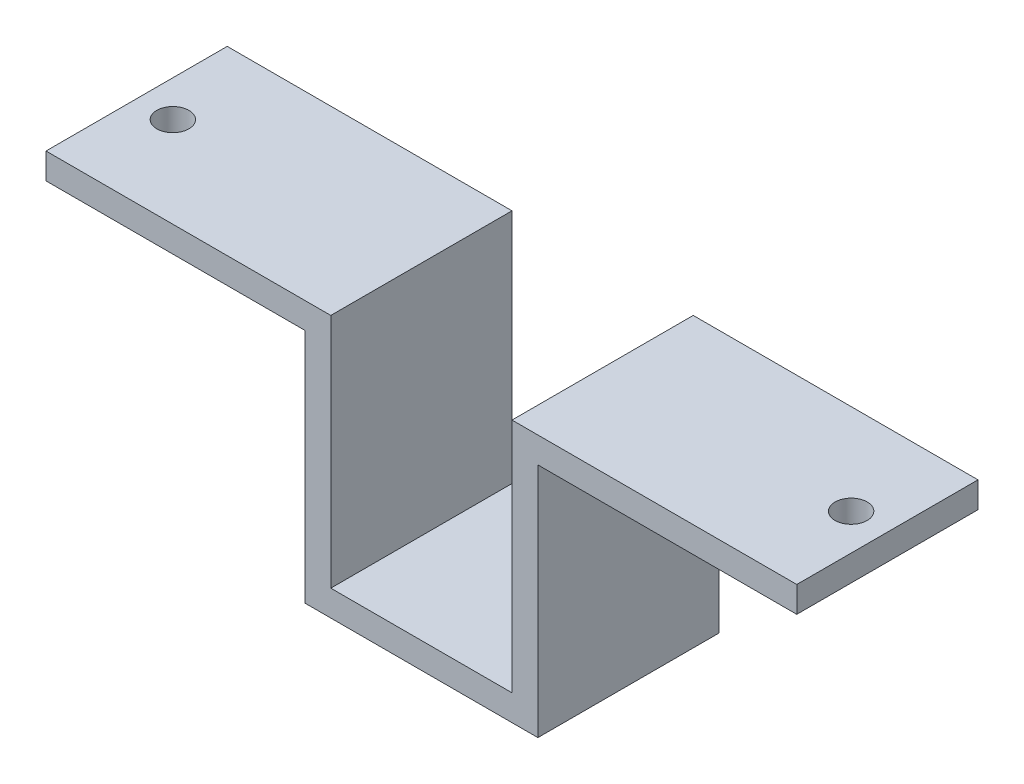
ISO-10303-21;
HEADER;
FILE_DESCRIPTION(('STEP AP214'),'2;1');
FILE_NAME('part.step','',(''),(''),'','','');
FILE_SCHEMA(('AUTOMOTIVE_DESIGN { 1 0 10303 214 1 1 1 1 }'));
ENDSEC;
DATA;
#1=APPLICATION_CONTEXT('core data for automotive mechanical design processes');
#2=APPLICATION_PROTOCOL_DEFINITION('international standard','automotive_design',2000,#1);
#3=PRODUCT_CONTEXT('',#1,'mechanical');
#4=PRODUCT('Part','Part','',(#3));
#5=PRODUCT_RELATED_PRODUCT_CATEGORY('part','',(#4));
#6=PRODUCT_DEFINITION_FORMATION('','',#4);
#7=PRODUCT_DEFINITION_CONTEXT('part definition',#1,'design');
#8=PRODUCT_DEFINITION('design','',#6,#7);
#9=PRODUCT_DEFINITION_SHAPE('','',#8);
#10=(LENGTH_UNIT() NAMED_UNIT(*) SI_UNIT(.MILLI.,.METRE.));
#11=(NAMED_UNIT(*) PLANE_ANGLE_UNIT() SI_UNIT($,.RADIAN.));
#12=(NAMED_UNIT(*) SI_UNIT($,.STERADIAN.) SOLID_ANGLE_UNIT());
#13=UNCERTAINTY_MEASURE_WITH_UNIT(LENGTH_MEASURE(1.E-05),#10,'distance_accuracy_value','');
#14=(GEOMETRIC_REPRESENTATION_CONTEXT(3) GLOBAL_UNCERTAINTY_ASSIGNED_CONTEXT((#13)) GLOBAL_UNIT_ASSIGNED_CONTEXT((#10,
#11,#12)) REPRESENTATION_CONTEXT('',''));
#15=CARTESIAN_POINT('',(0.,0.,0.));
#16=DIRECTION('',(0.,0.,1.));
#17=DIRECTION('',(1.,0.,0.));
#18=AXIS2_PLACEMENT_3D('',#15,#16,#17);
#19=CARTESIAN_POINT('',(-22.225,0.,44.45));
#20=DIRECTION('',(0.,1.,0.));
#21=DIRECTION('',(-1.,0.,0.));
#22=AXIS2_PLACEMENT_3D('',#19,#20,#21);
#23=PLANE('',#22);
#24=DIRECTION('',(1.,0.,0.));
#25=VECTOR('',#24,1.);
#26=CARTESIAN_POINT('',(-22.225,0.,0.));
#27=LINE('',#26,#25);
#28=CARTESIAN_POINT('',(-22.225,0.,0.));
#29=VERTEX_POINT('',#28);
#30=CARTESIAN_POINT('',(22.225,0.,0.));
#31=VERTEX_POINT('',#30);
#32=EDGE_CURVE('E172',#29,#31,#27,.T.);
#33=ORIENTED_EDGE('',*,*,#32,.F.);
#34=DIRECTION('',(0.,0.,-1.));
#35=VECTOR('',#34,1.);
#36=CARTESIAN_POINT('',(-22.225,0.,44.45));
#37=LINE('',#36,#35);
#38=CARTESIAN_POINT('',(-22.225,0.,44.45));
#39=VERTEX_POINT('',#38);
#40=EDGE_CURVE('E11',#39,#29,#37,.T.);
#41=ORIENTED_EDGE('',*,*,#40,.F.);
#42=DIRECTION('',(1.,0.,0.));
#43=VECTOR('',#42,1.);
#44=CARTESIAN_POINT('',(-22.225,0.,44.45));
#45=LINE('',#44,#43);
#46=CARTESIAN_POINT('',(22.225,0.,44.45));
#47=VERTEX_POINT('',#46);
#48=EDGE_CURVE('E215',#39,#47,#45,.T.);
#49=ORIENTED_EDGE('',*,*,#48,.T.);
#50=DIRECTION('',(0.,0.,-1.));
#51=VECTOR('',#50,1.);
#52=CARTESIAN_POINT('',(22.225,0.,44.45));
#53=LINE('',#52,#51);
#54=EDGE_CURVE('E47',#47,#31,#53,.T.);
#55=ORIENTED_EDGE('',*,*,#54,.T.);
#56=EDGE_LOOP('',(#33,#41,#49,#55));
#57=FACE_BOUND('',#56,.T.);
#58=ADVANCED_FACE('F44',(#57),#23,.T.);
#59=CARTESIAN_POINT('',(-22.225,0.,44.45));
#60=DIRECTION('',(-1.,0.,0.));
#61=DIRECTION('',(0.,0.,1.));
#62=AXIS2_PLACEMENT_3D('',#59,#60,#61);
#63=PLANE('',#62);
#64=DIRECTION('',(0.,1.,0.));
#65=VECTOR('',#64,1.);
#66=CARTESIAN_POINT('',(-22.225,0.,0.));
#67=LINE('',#66,#65);
#68=CARTESIAN_POINT('',(-22.225,57.9374,0.));
#69=VERTEX_POINT('',#68);
#70=EDGE_CURVE('E102',#29,#69,#67,.T.);
#71=ORIENTED_EDGE('',*,*,#70,.T.);
#72=DIRECTION('',(0.,0.,-1.));
#73=VECTOR('',#72,1.);
#74=CARTESIAN_POINT('',(-22.225,57.9374,44.45));
#75=LINE('',#74,#73);
#76=CARTESIAN_POINT('',(-22.225,57.9374,44.45));
#77=VERTEX_POINT('',#76);
#78=EDGE_CURVE('E54',#77,#69,#75,.T.);
#79=ORIENTED_EDGE('',*,*,#78,.F.);
#80=DIRECTION('',(0.,1.,0.));
#81=VECTOR('',#80,1.);
#82=CARTESIAN_POINT('',(-22.225,0.,44.45));
#83=LINE('',#82,#81);
#84=EDGE_CURVE('E145',#39,#77,#83,.T.);
#85=ORIENTED_EDGE('',*,*,#84,.F.);
#86=ORIENTED_EDGE('',*,*,#40,.T.);
#87=EDGE_LOOP('',(#71,#79,#85,#86));
#88=FACE_BOUND('',#87,.T.);
#89=ADVANCED_FACE('F337',(#88),#63,.F.);
#90=CARTESIAN_POINT('',(-22.225,57.9374,44.45));
#91=DIRECTION('',(0.,-1.,0.));
#92=DIRECTION('',(1.,0.,0.));
#93=AXIS2_PLACEMENT_3D('',#90,#91,#92);
#94=PLANE('',#93);
#95=CARTESIAN_POINT('',(-83.185,57.9374,22.225));
#96=DIRECTION('',(0.,-1.,0.));
#97=DIRECTION('',(-1.,0.,0.));
#98=AXIS2_PLACEMENT_3D('',#95,#96,#97);
#99=CIRCLE('',#98,3.937);
#100=CARTESIAN_POINT('',(-79.248,57.9374,22.225));
#101=VERTEX_POINT('',#100);
#102=EDGE_CURVE('E284',#101,#101,#99,.T.);
#103=ORIENTED_EDGE('',*,*,#102,.T.);
#104=EDGE_LOOP('',(#103));
#105=FACE_BOUND('',#104,.T.);
#106=DIRECTION('',(-1.,0.,0.));
#107=VECTOR('',#106,1.);
#108=CARTESIAN_POINT('',(-22.225,57.9374,0.));
#109=LINE('',#108,#107);
#110=CARTESIAN_POINT('',(-92.075,57.9374,0.));
#111=VERTEX_POINT('',#110);
#112=EDGE_CURVE('E153',#69,#111,#109,.T.);
#113=ORIENTED_EDGE('',*,*,#112,.T.);
#114=DIRECTION('',(0.,0.,-1.));
#115=VECTOR('',#114,1.);
#116=CARTESIAN_POINT('',(-92.075,57.9374,44.45));
#117=LINE('',#116,#115);
#118=CARTESIAN_POINT('',(-92.075,57.9374,44.45));
#119=VERTEX_POINT('',#118);
#120=EDGE_CURVE('E150',#119,#111,#117,.T.);
#121=ORIENTED_EDGE('',*,*,#120,.F.);
#122=DIRECTION('',(-1.,0.,0.));
#123=VECTOR('',#122,1.);
#124=CARTESIAN_POINT('',(-28.575,57.9374,44.45));
#125=LINE('',#124,#123);
#126=EDGE_CURVE('E138',#77,#119,#125,.T.);
#127=ORIENTED_EDGE('',*,*,#126,.F.);
#128=ORIENTED_EDGE('',*,*,#78,.T.);
#129=EDGE_LOOP('',(#113,#121,#127,#128));
#130=FACE_BOUND('',#129,.T.);
#131=ADVANCED_FACE('F151',(#105,#130),#94,.F.);
#132=CARTESIAN_POINT('',(-92.075,57.9374,44.45));
#133=DIRECTION('',(1.,0.,0.));
#134=DIRECTION('',(0.,0.,-1.));
#135=AXIS2_PLACEMENT_3D('',#132,#133,#134);
#136=PLANE('',#135);
#137=DIRECTION('',(0.,-1.,0.));
#138=VECTOR('',#137,1.);
#139=CARTESIAN_POINT('',(-92.075,57.9374,0.));
#140=LINE('',#139,#138);
#141=CARTESIAN_POINT('',(-92.075,51.5874,0.));
#142=VERTEX_POINT('',#141);
#143=EDGE_CURVE('E209',#111,#142,#140,.T.);
#144=ORIENTED_EDGE('',*,*,#143,.T.);
#145=DIRECTION('',(0.,0.,-1.));
#146=VECTOR('',#145,1.);
#147=CARTESIAN_POINT('',(-92.075,51.5874,44.45));
#148=LINE('',#147,#146);
#149=CARTESIAN_POINT('',(-92.075,51.5874,44.45));
#150=VERTEX_POINT('',#149);
#151=EDGE_CURVE('E157',#150,#142,#148,.T.);
#152=ORIENTED_EDGE('',*,*,#151,.F.);
#153=DIRECTION('',(0.,-1.,0.));
#154=VECTOR('',#153,1.);
#155=CARTESIAN_POINT('',(-92.075,57.9374,44.45));
#156=LINE('',#155,#154);
#157=EDGE_CURVE('E143',#119,#150,#156,.T.);
#158=ORIENTED_EDGE('',*,*,#157,.F.);
#159=ORIENTED_EDGE('',*,*,#120,.T.);
#160=EDGE_LOOP('',(#144,#152,#158,#159));
#161=FACE_BOUND('',#160,.T.);
#162=ADVANCED_FACE('F159',(#161),#136,.F.);
#163=CARTESIAN_POINT('',(-92.075,51.5874,44.45));
#164=DIRECTION('',(0.,1.,0.));
#165=DIRECTION('',(-1.,0.,0.));
#166=AXIS2_PLACEMENT_3D('',#163,#164,#165);
#167=PLANE('',#166);
#168=CARTESIAN_POINT('',(-83.185,51.5874,22.225));
#169=DIRECTION('',(0.,-1.,0.));
#170=DIRECTION('',(-1.,0.,0.));
#171=AXIS2_PLACEMENT_3D('',#168,#169,#170);
#172=CIRCLE('',#171,3.937);
#173=CARTESIAN_POINT('',(-79.248,51.5874,22.225));
#174=VERTEX_POINT('',#173);
#175=EDGE_CURVE('E288',#174,#174,#172,.T.);
#176=ORIENTED_EDGE('',*,*,#175,.F.);
#177=EDGE_LOOP('',(#176));
#178=FACE_BOUND('',#177,.T.);
#179=DIRECTION('',(1.,0.,0.));
#180=VECTOR('',#179,1.);
#181=CARTESIAN_POINT('',(-92.075,51.5874,0.));
#182=LINE('',#181,#180);
#183=CARTESIAN_POINT('',(-28.575,51.5874,0.));
#184=VERTEX_POINT('',#183);
#185=EDGE_CURVE('E205',#142,#184,#182,.T.);
#186=ORIENTED_EDGE('',*,*,#185,.T.);
#187=DIRECTION('',(0.,0.,-1.));
#188=VECTOR('',#187,1.);
#189=CARTESIAN_POINT('',(-28.575,51.5874,44.45));
#190=LINE('',#189,#188);
#191=CARTESIAN_POINT('',(-28.575,51.5874,44.45));
#192=VERTEX_POINT('',#191);
#193=EDGE_CURVE('E221',#192,#184,#190,.T.);
#194=ORIENTED_EDGE('',*,*,#193,.F.);
#195=DIRECTION('',(1.,0.,0.));
#196=VECTOR('',#195,1.);
#197=CARTESIAN_POINT('',(-92.075,51.5874,44.45));
#198=LINE('',#197,#196);
#199=EDGE_CURVE('E163',#150,#192,#198,.T.);
#200=ORIENTED_EDGE('',*,*,#199,.F.);
#201=ORIENTED_EDGE('',*,*,#151,.T.);
#202=EDGE_LOOP('',(#186,#194,#200,#201));
#203=FACE_BOUND('',#202,.T.);
#204=ADVANCED_FACE('F247',(#178,#203),#167,.F.);
#205=CARTESIAN_POINT('',(-28.575,-6.35000000000001,44.45));
#206=DIRECTION('',(-1.,0.,0.));
#207=DIRECTION('',(0.,-1.,0.));
#208=AXIS2_PLACEMENT_3D('',#205,#206,#207);
#209=PLANE('',#208);
#210=DIRECTION('',(0.,1.,0.));
#211=VECTOR('',#210,1.);
#212=CARTESIAN_POINT('',(-28.575,-6.35000000000001,0.));
#213=LINE('',#212,#211);
#214=CARTESIAN_POINT('',(-28.575,-6.35000000000001,0.));
#215=VERTEX_POINT('',#214);
#216=EDGE_CURVE('E201',#215,#184,#213,.T.);
#217=ORIENTED_EDGE('',*,*,#216,.F.);
#218=DIRECTION('',(0.,0.,-1.));
#219=VECTOR('',#218,1.);
#220=CARTESIAN_POINT('',(-28.575,-6.35000000000001,44.45));
#221=LINE('',#220,#219);
#222=CARTESIAN_POINT('',(-28.575,-6.35000000000001,44.45));
#223=VERTEX_POINT('',#222);
#224=EDGE_CURVE('E224',#223,#215,#221,.T.);
#225=ORIENTED_EDGE('',*,*,#224,.F.);
#226=DIRECTION('',(0.,1.,0.));
#227=VECTOR('',#226,1.);
#228=CARTESIAN_POINT('',(-28.575,-6.35000000000001,44.45));
#229=LINE('',#228,#227);
#230=EDGE_CURVE('E166',#223,#192,#229,.T.);
#231=ORIENTED_EDGE('',*,*,#230,.T.);
#232=ORIENTED_EDGE('',*,*,#193,.T.);
#233=EDGE_LOOP('',(#217,#225,#231,#232));
#234=FACE_BOUND('',#233,.T.);
#235=ADVANCED_FACE('F325',(#234),#209,.T.);
#236=CARTESIAN_POINT('',(28.575,-6.35,44.45));
#237=DIRECTION('',(0.,-1.,0.));
#238=DIRECTION('',(1.,0.,0.));
#239=AXIS2_PLACEMENT_3D('',#236,#237,#238);
#240=PLANE('',#239);
#241=DIRECTION('',(-1.,0.,0.));
#242=VECTOR('',#241,1.);
#243=CARTESIAN_POINT('',(28.575,-6.35,0.));
#244=LINE('',#243,#242);
#245=CARTESIAN_POINT('',(28.575,-6.35,0.));
#246=VERTEX_POINT('',#245);
#247=EDGE_CURVE('E197',#246,#215,#244,.T.);
#248=ORIENTED_EDGE('',*,*,#247,.F.);
#249=DIRECTION('',(0.,0.,-1.));
#250=VECTOR('',#249,1.);
#251=CARTESIAN_POINT('',(28.575,-6.35,44.45));
#252=LINE('',#251,#250);
#253=CARTESIAN_POINT('',(28.575,-6.35,44.45));
#254=VERTEX_POINT('',#253);
#255=EDGE_CURVE('E227',#254,#246,#252,.T.);
#256=ORIENTED_EDGE('',*,*,#255,.F.);
#257=DIRECTION('',(-1.,0.,0.));
#258=VECTOR('',#257,1.);
#259=CARTESIAN_POINT('',(28.575,-6.35,44.45));
#260=LINE('',#259,#258);
#261=EDGE_CURVE('E254',#254,#223,#260,.T.);
#262=ORIENTED_EDGE('',*,*,#261,.T.);
#263=ORIENTED_EDGE('',*,*,#224,.T.);
#264=EDGE_LOOP('',(#248,#256,#262,#263));
#265=FACE_BOUND('',#264,.T.);
#266=ADVANCED_FACE('F260',(#265),#240,.T.);
#267=CARTESIAN_POINT('',(28.575,51.5874,44.45));
#268=DIRECTION('',(1.,0.,0.));
#269=DIRECTION('',(0.,1.,0.));
#270=AXIS2_PLACEMENT_3D('',#267,#268,#269);
#271=PLANE('',#270);
#272=DIRECTION('',(0.,-1.,0.));
#273=VECTOR('',#272,1.);
#274=CARTESIAN_POINT('',(28.575,51.5874,0.));
#275=LINE('',#274,#273);
#276=CARTESIAN_POINT('',(28.575,51.5874,0.));
#277=VERTEX_POINT('',#276);
#278=EDGE_CURVE('E193',#277,#246,#275,.T.);
#279=ORIENTED_EDGE('',*,*,#278,.F.);
#280=DIRECTION('',(0.,0.,-1.));
#281=VECTOR('',#280,1.);
#282=CARTESIAN_POINT('',(28.575,51.5874,44.45));
#283=LINE('',#282,#281);
#284=CARTESIAN_POINT('',(28.575,51.5874,44.45));
#285=VERTEX_POINT('',#284);
#286=EDGE_CURVE('E230',#285,#277,#283,.T.);
#287=ORIENTED_EDGE('',*,*,#286,.F.);
#288=DIRECTION('',(0.,-1.,0.));
#289=VECTOR('',#288,1.);
#290=CARTESIAN_POINT('',(28.575,51.5874,44.45));
#291=LINE('',#290,#289);
#292=EDGE_CURVE('E263',#285,#254,#291,.T.);
#293=ORIENTED_EDGE('',*,*,#292,.T.);
#294=ORIENTED_EDGE('',*,*,#255,.T.);
#295=EDGE_LOOP('',(#279,#287,#293,#294));
#296=FACE_BOUND('',#295,.T.);
#297=ADVANCED_FACE('F314',(#296),#271,.T.);
#298=CARTESIAN_POINT('',(92.075,51.5874,44.45));
#299=DIRECTION('',(0.,-1.,0.));
#300=DIRECTION('',(1.,0.,0.));
#301=AXIS2_PLACEMENT_3D('',#298,#299,#300);
#302=PLANE('',#301);
#303=CARTESIAN_POINT('',(83.185,51.5874,22.225));
#304=DIRECTION('',(0.,-1.,0.));
#305=DIRECTION('',(1.,0.,0.));
#306=AXIS2_PLACEMENT_3D('',#303,#304,#305);
#307=CIRCLE('',#306,3.937);
#308=CARTESIAN_POINT('',(87.122,51.5874,22.225));
#309=VERTEX_POINT('',#308);
#310=EDGE_CURVE('E292',#309,#309,#307,.T.);
#311=ORIENTED_EDGE('',*,*,#310,.F.);
#312=EDGE_LOOP('',(#311));
#313=FACE_BOUND('',#312,.T.);
#314=DIRECTION('',(-1.,0.,0.));
#315=VECTOR('',#314,1.);
#316=CARTESIAN_POINT('',(92.075,51.5874,0.));
#317=LINE('',#316,#315);
#318=CARTESIAN_POINT('',(92.075,51.5874,0.));
#319=VERTEX_POINT('',#318);
#320=EDGE_CURVE('E189',#319,#277,#317,.T.);
#321=ORIENTED_EDGE('',*,*,#320,.F.);
#322=DIRECTION('',(0.,0.,-1.));
#323=VECTOR('',#322,1.);
#324=CARTESIAN_POINT('',(92.075,51.5874,44.45));
#325=LINE('',#324,#323);
#326=CARTESIAN_POINT('',(92.075,51.5874,44.45));
#327=VERTEX_POINT('',#326);
#328=EDGE_CURVE('E233',#327,#319,#325,.T.);
#329=ORIENTED_EDGE('',*,*,#328,.F.);
#330=DIRECTION('',(-1.,0.,0.));
#331=VECTOR('',#330,1.);
#332=CARTESIAN_POINT('',(92.075,51.5874,44.45));
#333=LINE('',#332,#331);
#334=EDGE_CURVE('E266',#327,#285,#333,.T.);
#335=ORIENTED_EDGE('',*,*,#334,.T.);
#336=ORIENTED_EDGE('',*,*,#286,.T.);
#337=EDGE_LOOP('',(#321,#329,#335,#336));
#338=FACE_BOUND('',#337,.T.);
#339=ADVANCED_FACE('F310',(#313,#338),#302,.T.);
#340=CARTESIAN_POINT('',(92.075,57.9374,44.45));
#341=DIRECTION('',(1.,0.,0.));
#342=DIRECTION('',(0.,0.,-1.));
#343=AXIS2_PLACEMENT_3D('',#340,#341,#342);
#344=PLANE('',#343);
#345=DIRECTION('',(0.,-1.,0.));
#346=VECTOR('',#345,1.);
#347=CARTESIAN_POINT('',(92.075,57.9374,0.));
#348=LINE('',#347,#346);
#349=CARTESIAN_POINT('',(92.075,57.9374,0.));
#350=VERTEX_POINT('',#349);
#351=EDGE_CURVE('E185',#350,#319,#348,.T.);
#352=ORIENTED_EDGE('',*,*,#351,.F.);
#353=DIRECTION('',(0.,0.,-1.));
#354=VECTOR('',#353,1.);
#355=CARTESIAN_POINT('',(92.075,57.9374,44.45));
#356=LINE('',#355,#354);
#357=CARTESIAN_POINT('',(92.075,57.9374,44.45));
#358=VERTEX_POINT('',#357);
#359=EDGE_CURVE('E236',#358,#350,#356,.T.);
#360=ORIENTED_EDGE('',*,*,#359,.F.);
#361=DIRECTION('',(0.,-1.,0.));
#362=VECTOR('',#361,1.);
#363=CARTESIAN_POINT('',(92.075,57.9374,44.45));
#364=LINE('',#363,#362);
#365=EDGE_CURVE('E272',#358,#327,#364,.T.);
#366=ORIENTED_EDGE('',*,*,#365,.T.);
#367=ORIENTED_EDGE('',*,*,#328,.T.);
#368=EDGE_LOOP('',(#352,#360,#366,#367));
#369=FACE_BOUND('',#368,.T.);
#370=ADVANCED_FACE('F313',(#369),#344,.T.);
#371=CARTESIAN_POINT('',(28.575,57.9374,44.45));
#372=DIRECTION('',(0.,1.,0.));
#373=DIRECTION('',(-1.,0.,0.));
#374=AXIS2_PLACEMENT_3D('',#371,#372,#373);
#375=PLANE('',#374);
#376=CARTESIAN_POINT('',(83.185,57.9374000000001,22.225));
#377=DIRECTION('',(0.,-1.,0.));
#378=DIRECTION('',(1.,0.,0.));
#379=AXIS2_PLACEMENT_3D('',#376,#377,#378);
#380=CIRCLE('',#379,3.937);
#381=CARTESIAN_POINT('',(87.122,57.9374000000001,22.225));
#382=VERTEX_POINT('',#381);
#383=EDGE_CURVE('E177',#382,#382,#380,.T.);
#384=ORIENTED_EDGE('',*,*,#383,.T.);
#385=EDGE_LOOP('',(#384));
#386=FACE_BOUND('',#385,.T.);
#387=DIRECTION('',(1.,0.,0.));
#388=VECTOR('',#387,1.);
#389=CARTESIAN_POINT('',(28.575,57.9374,0.));
#390=LINE('',#389,#388);
#391=CARTESIAN_POINT('',(22.225,57.9374,0.));
#392=VERTEX_POINT('',#391);
#393=EDGE_CURVE('E181',#392,#350,#390,.T.);
#394=ORIENTED_EDGE('',*,*,#393,.F.);
#395=DIRECTION('',(0.,0.,-1.));
#396=VECTOR('',#395,1.);
#397=CARTESIAN_POINT('',(22.225,57.9374,44.45));
#398=LINE('',#397,#396);
#399=CARTESIAN_POINT('',(22.225,57.9374,44.45));
#400=VERTEX_POINT('',#399);
#401=EDGE_CURVE('E238',#400,#392,#398,.T.);
#402=ORIENTED_EDGE('',*,*,#401,.F.);
#403=DIRECTION('',(1.,0.,0.));
#404=VECTOR('',#403,1.);
#405=CARTESIAN_POINT('',(22.225,57.9374,44.45));
#406=LINE('',#405,#404);
#407=EDGE_CURVE('E276',#400,#358,#406,.T.);
#408=ORIENTED_EDGE('',*,*,#407,.T.);
#409=ORIENTED_EDGE('',*,*,#359,.T.);
#410=EDGE_LOOP('',(#394,#402,#408,#409));
#411=FACE_BOUND('',#410,.T.);
#412=ADVANCED_FACE('F300',(#386,#411),#375,.T.);
#413=CARTESIAN_POINT('',(22.225,0.,44.45));
#414=DIRECTION('',(-1.,0.,0.));
#415=DIRECTION('',(0.,-1.,0.));
#416=AXIS2_PLACEMENT_3D('',#413,#414,#415);
#417=PLANE('',#416);
#418=DIRECTION('',(0.,1.,0.));
#419=VECTOR('',#418,1.);
#420=CARTESIAN_POINT('',(22.225,0.,0.));
#421=LINE('',#420,#419);
#422=EDGE_CURVE('E176',#31,#392,#421,.T.);
#423=ORIENTED_EDGE('',*,*,#422,.F.);
#424=ORIENTED_EDGE('',*,*,#54,.F.);
#425=DIRECTION('',(0.,1.,0.));
#426=VECTOR('',#425,1.);
#427=CARTESIAN_POINT('',(22.225,0.,44.45));
#428=LINE('',#427,#426);
#429=EDGE_CURVE('E279',#47,#400,#428,.T.);
#430=ORIENTED_EDGE('',*,*,#429,.T.);
#431=ORIENTED_EDGE('',*,*,#401,.T.);
#432=EDGE_LOOP('',(#423,#424,#430,#431));
#433=FACE_BOUND('',#432,.T.);
#434=ADVANCED_FACE('F242',(#433),#417,.T.);
#435=CARTESIAN_POINT('',(0.,0.,44.45));
#436=DIRECTION('',(0.,0.,1.));
#437=DIRECTION('',(1.,0.,0.));
#438=AXIS2_PLACEMENT_3D('',#435,#436,#437);
#439=PLANE('',#438);
#440=ORIENTED_EDGE('',*,*,#48,.F.);
#441=ORIENTED_EDGE('',*,*,#84,.T.);
#442=ORIENTED_EDGE('',*,*,#126,.T.);
#443=ORIENTED_EDGE('',*,*,#157,.T.);
#444=ORIENTED_EDGE('',*,*,#199,.T.);
#445=ORIENTED_EDGE('',*,*,#230,.F.);
#446=ORIENTED_EDGE('',*,*,#261,.F.);
#447=ORIENTED_EDGE('',*,*,#292,.F.);
#448=ORIENTED_EDGE('',*,*,#334,.F.);
#449=ORIENTED_EDGE('',*,*,#365,.F.);
#450=ORIENTED_EDGE('',*,*,#407,.F.);
#451=ORIENTED_EDGE('',*,*,#429,.F.);
#452=EDGE_LOOP('',(#440,#441,#442,#443,#444,#445,#446,#447,#448,#449,#450,#451));
#453=FACE_BOUND('',#452,.T.);
#454=ADVANCED_FACE('F141',(#453),#439,.T.);
#455=CARTESIAN_POINT('',(0.,0.,0.));
#456=DIRECTION('',(0.,0.,1.));
#457=DIRECTION('',(1.,0.,0.));
#458=AXIS2_PLACEMENT_3D('',#455,#456,#457);
#459=PLANE('',#458);
#460=ORIENTED_EDGE('',*,*,#32,.T.);
#461=ORIENTED_EDGE('',*,*,#422,.T.);
#462=ORIENTED_EDGE('',*,*,#393,.T.);
#463=ORIENTED_EDGE('',*,*,#351,.T.);
#464=ORIENTED_EDGE('',*,*,#320,.T.);
#465=ORIENTED_EDGE('',*,*,#278,.T.);
#466=ORIENTED_EDGE('',*,*,#247,.T.);
#467=ORIENTED_EDGE('',*,*,#216,.T.);
#468=ORIENTED_EDGE('',*,*,#185,.F.);
#469=ORIENTED_EDGE('',*,*,#143,.F.);
#470=ORIENTED_EDGE('',*,*,#112,.F.);
#471=ORIENTED_EDGE('',*,*,#70,.F.);
#472=EDGE_LOOP('',(#460,#461,#462,#463,#464,#465,#466,#467,#468,#469,#470,#471));
#473=FACE_BOUND('',#472,.T.);
#474=ADVANCED_FACE('F244',(#473),#459,.F.);
#475=CARTESIAN_POINT('',(83.185,57.9374000000001,22.225));
#476=DIRECTION('',(0.,-1.,0.));
#477=DIRECTION('',(1.,0.,0.));
#478=AXIS2_PLACEMENT_3D('',#475,#476,#477);
#479=CYLINDRICAL_SURFACE('',#478,3.937);
#480=CARTESIAN_POINT('',(87.122,57.9374000000001,22.225));
#481=CARTESIAN_POINT('',(87.122,57.8712541666668,22.225));
#482=CARTESIAN_POINT('',(87.122,57.8051083333334,22.225));
#483=CARTESIAN_POINT('',(87.122,57.6728166666668,22.225));
#484=CARTESIAN_POINT('',(87.122,57.6066708333334,22.225));
#485=CARTESIAN_POINT('',(87.122,57.4743791666668,22.225));
#486=CARTESIAN_POINT('',(87.122,57.4082333333334,22.225));
#487=CARTESIAN_POINT('',(87.122,57.2759416666668,22.225));
#488=CARTESIAN_POINT('',(87.122,57.2097958333334,22.225));
#489=CARTESIAN_POINT('',(87.122,57.0775041666668,22.225));
#490=CARTESIAN_POINT('',(87.122,57.0113583333334,22.225));
#491=CARTESIAN_POINT('',(87.122,56.8790666666668,22.225));
#492=CARTESIAN_POINT('',(87.122,56.8129208333334,22.225));
#493=CARTESIAN_POINT('',(87.122,56.6806291666668,22.225));
#494=CARTESIAN_POINT('',(87.122,56.6144833333334,22.225));
#495=CARTESIAN_POINT('',(87.122,56.4821916666668,22.225));
#496=CARTESIAN_POINT('',(87.122,56.4160458333334,22.225));
#497=CARTESIAN_POINT('',(87.122,56.2837541666668,22.225));
#498=CARTESIAN_POINT('',(87.122,56.2176083333334,22.225));
#499=CARTESIAN_POINT('',(87.122,56.0853166666668,22.225));
#500=CARTESIAN_POINT('',(87.122,56.0191708333334,22.225));
#501=CARTESIAN_POINT('',(87.122,55.8868791666668,22.225));
#502=CARTESIAN_POINT('',(87.122,55.8207333333334,22.225));
#503=CARTESIAN_POINT('',(87.122,55.6884416666667,22.225));
#504=CARTESIAN_POINT('',(87.122,55.6222958333334,22.225));
#505=CARTESIAN_POINT('',(87.122,55.4900041666667,22.225));
#506=CARTESIAN_POINT('',(87.122,55.4238583333334,22.225));
#507=CARTESIAN_POINT('',(87.122,55.2915666666667,22.225));
#508=CARTESIAN_POINT('',(87.122,55.2254208333334,22.225));
#509=CARTESIAN_POINT('',(87.122,55.0931291666667,22.225));
#510=CARTESIAN_POINT('',(87.122,55.0269833333334,22.225));
#511=CARTESIAN_POINT('',(87.122,54.8946916666667,22.225));
#512=CARTESIAN_POINT('',(87.122,54.8285458333334,22.225));
#513=CARTESIAN_POINT('',(87.122,54.6962541666667,22.225));
#514=CARTESIAN_POINT('',(87.122,54.6301083333334,22.225));
#515=CARTESIAN_POINT('',(87.122,54.4978166666667,22.225));
#516=CARTESIAN_POINT('',(87.122,54.4316708333334,22.225));
#517=CARTESIAN_POINT('',(87.122,54.2993791666667,22.225));
#518=CARTESIAN_POINT('',(87.122,54.2332333333334,22.225));
#519=CARTESIAN_POINT('',(87.122,54.1009416666667,22.225));
#520=CARTESIAN_POINT('',(87.122,54.0347958333334,22.225));
#521=CARTESIAN_POINT('',(87.122,53.9025041666667,22.225));
#522=CARTESIAN_POINT('',(87.122,53.8363583333334,22.225));
#523=CARTESIAN_POINT('',(87.122,53.7040666666667,22.225));
#524=CARTESIAN_POINT('',(87.122,53.6379208333334,22.225));
#525=CARTESIAN_POINT('',(87.122,53.5056291666667,22.225));
#526=CARTESIAN_POINT('',(87.122,53.4394833333334,22.225));
#527=CARTESIAN_POINT('',(87.122,53.3071916666667,22.225));
#528=CARTESIAN_POINT('',(87.122,53.2410458333334,22.225));
#529=CARTESIAN_POINT('',(87.122,53.1087541666667,22.225));
#530=CARTESIAN_POINT('',(87.122,53.0426083333334,22.225));
#531=CARTESIAN_POINT('',(87.122,52.9103166666667,22.225));
#532=CARTESIAN_POINT('',(87.122,52.8441708333334,22.225));
#533=CARTESIAN_POINT('',(87.122,52.7118791666667,22.225));
#534=CARTESIAN_POINT('',(87.122,52.6457333333334,22.225));
#535=CARTESIAN_POINT('',(87.122,52.5134416666667,22.225));
#536=CARTESIAN_POINT('',(87.122,52.4472958333334,22.225));
#537=CARTESIAN_POINT('',(87.122,52.3150041666667,22.225));
#538=CARTESIAN_POINT('',(87.122,52.2488583333334,22.225));
#539=CARTESIAN_POINT('',(87.122,52.1165666666667,22.225));
#540=CARTESIAN_POINT('',(87.122,52.0504208333334,22.225));
#541=CARTESIAN_POINT('',(87.122,51.9181291666667,22.225));
#542=CARTESIAN_POINT('',(87.122,51.8519833333334,22.225));
#543=CARTESIAN_POINT('',(87.122,51.7196916666667,22.225));
#544=CARTESIAN_POINT('',(87.122,51.6535458333334,22.225));
#545=CARTESIAN_POINT('',(87.122,51.5874,22.225));
#546=B_SPLINE_CURVE_WITH_KNOTS('',3,(#480,#481,#482,#483,#484,#485,#486,#487,#488,#489,#490,
#491,#492,#493,#494,#495,#496,#497,#498,#499,#500,#501,#502,#503,#504,#505,#506,#507,#508,#509,
#510,#511,#512,#513,#514,#515,#516,#517,#518,#519,#520,#521,#522,#523,#524,#525,#526,#527,#528,
#529,#530,#531,#532,#533,#534,#535,#536,#537,#538,#539,#540,#541,#542,#543,#544,#545),
.UNSPECIFIED.,.F.,.F.,(4,2,2,2,2,2,2,2,2,2,2,2,2,2,2,2,2,2,2,2,2,2,2,2,2,2,2,2,2,2,2,2,4),(0.,
0.198437500000009,0.396875000000012,0.595312500000014,0.793750000000017,0.992187500000019,
1.19062500000002,1.38906250000002,1.58750000000003,1.78593750000003,1.98437500000003,
2.18281250000003,2.38125000000004,2.57968750000004,2.77812500000004,2.97656250000004,
3.17500000000005,3.37343750000006,3.57187500000006,3.77031250000006,3.96875000000006,
4.16718750000006,4.36562500000007,4.56406250000007,4.76250000000007,4.96093750000007,
5.15937500000008,5.35781250000008,5.55625000000008,5.75468750000008,5.95312500000009,
6.15156250000009,6.35000000000009),.UNSPECIFIED.);
#547=EDGE_CURVE('BSEAM303',#382,#309,#546,.T.);
#548=ORIENTED_EDGE('',*,*,#383,.F.);
#549=ORIENTED_EDGE('',*,*,#310,.T.);
#550=ORIENTED_EDGE('',*,*,#547,.T.);
#551=ORIENTED_EDGE('',*,*,#547,.F.);
#552=EDGE_LOOP('',(#548,#550,#549,#551));
#553=FACE_BOUND('',#552,.T.);
#554=ADVANCED_FACE('F303',(#553),#479,.F.);
#555=CARTESIAN_POINT('',(-83.185,57.9374,22.225));
#556=DIRECTION('',(0.,-1.,0.));
#557=DIRECTION('',(1.,0.,0.));
#558=AXIS2_PLACEMENT_3D('',#555,#556,#557);
#559=CYLINDRICAL_SURFACE('',#558,3.937);
#560=CARTESIAN_POINT('',(-79.248,57.9374,22.225));
#561=CARTESIAN_POINT('',(-79.248,57.8712541666667,22.225));
#562=CARTESIAN_POINT('',(-79.248,57.8051083333334,22.225));
#563=CARTESIAN_POINT('',(-79.248,57.6728166666667,22.225));
#564=CARTESIAN_POINT('',(-79.248,57.6066708333334,22.225));
#565=CARTESIAN_POINT('',(-79.248,57.4743791666667,22.225));
#566=CARTESIAN_POINT('',(-79.248,57.4082333333334,22.225));
#567=CARTESIAN_POINT('',(-79.248,57.2759416666667,22.225));
#568=CARTESIAN_POINT('',(-79.248,57.2097958333334,22.225));
#569=CARTESIAN_POINT('',(-79.248,57.0775041666667,22.225));
#570=CARTESIAN_POINT('',(-79.248,57.0113583333334,22.225));
#571=CARTESIAN_POINT('',(-79.248,56.8790666666667,22.225));
#572=CARTESIAN_POINT('',(-79.248,56.8129208333334,22.225));
#573=CARTESIAN_POINT('',(-79.248,56.6806291666667,22.225));
#574=CARTESIAN_POINT('',(-79.248,56.6144833333334,22.225));
#575=CARTESIAN_POINT('',(-79.248,56.4821916666667,22.225));
#576=CARTESIAN_POINT('',(-79.248,56.4160458333334,22.225));
#577=CARTESIAN_POINT('',(-79.248,56.2837541666667,22.225));
#578=CARTESIAN_POINT('',(-79.248,56.2176083333334,22.225));
#579=CARTESIAN_POINT('',(-79.248,56.0853166666667,22.225));
#580=CARTESIAN_POINT('',(-79.248,56.0191708333334,22.225));
#581=CARTESIAN_POINT('',(-79.248,55.8868791666667,22.225));
#582=CARTESIAN_POINT('',(-79.248,55.8207333333334,22.225));
#583=CARTESIAN_POINT('',(-79.248,55.6884416666667,22.225));
#584=CARTESIAN_POINT('',(-79.248,55.6222958333333,22.225));
#585=CARTESIAN_POINT('',(-79.248,55.4900041666667,22.225));
#586=CARTESIAN_POINT('',(-79.248,55.4238583333333,22.225));
#587=CARTESIAN_POINT('',(-79.248,55.2915666666667,22.225));
#588=CARTESIAN_POINT('',(-79.248,55.2254208333333,22.225));
#589=CARTESIAN_POINT('',(-79.248,55.0931291666667,22.225));
#590=CARTESIAN_POINT('',(-79.248,55.0269833333333,22.225));
#591=CARTESIAN_POINT('',(-79.248,54.8946916666667,22.225));
#592=CARTESIAN_POINT('',(-79.248,54.8285458333333,22.225));
#593=CARTESIAN_POINT('',(-79.248,54.6962541666667,22.225));
#594=CARTESIAN_POINT('',(-79.248,54.6301083333333,22.225));
#595=CARTESIAN_POINT('',(-79.248,54.4978166666667,22.225));
#596=CARTESIAN_POINT('',(-79.248,54.4316708333333,22.225));
#597=CARTESIAN_POINT('',(-79.248,54.2993791666667,22.225));
#598=CARTESIAN_POINT('',(-79.248,54.2332333333333,22.225));
#599=CARTESIAN_POINT('',(-79.248,54.1009416666666,22.225));
#600=CARTESIAN_POINT('',(-79.248,54.0347958333333,22.225));
#601=CARTESIAN_POINT('',(-79.248,53.9025041666667,22.225));
#602=CARTESIAN_POINT('',(-79.248,53.8363583333333,22.225));
#603=CARTESIAN_POINT('',(-79.248,53.7040666666666,22.225));
#604=CARTESIAN_POINT('',(-79.248,53.6379208333333,22.225));
#605=CARTESIAN_POINT('',(-79.248,53.5056291666666,22.225));
#606=CARTESIAN_POINT('',(-79.248,53.4394833333333,22.225));
#607=CARTESIAN_POINT('',(-79.248,53.3071916666666,22.225));
#608=CARTESIAN_POINT('',(-79.248,53.2410458333333,22.225));
#609=CARTESIAN_POINT('',(-79.248,53.1087541666666,22.225));
#610=CARTESIAN_POINT('',(-79.248,53.0426083333333,22.225));
#611=CARTESIAN_POINT('',(-79.248,52.9103166666666,22.225));
#612=CARTESIAN_POINT('',(-79.248,52.8441708333333,22.225));
#613=CARTESIAN_POINT('',(-79.248,52.7118791666666,22.225));
#614=CARTESIAN_POINT('',(-79.248,52.6457333333333,22.225));
#615=CARTESIAN_POINT('',(-79.248,52.5134416666666,22.225));
#616=CARTESIAN_POINT('',(-79.248,52.4472958333333,22.225));
#617=CARTESIAN_POINT('',(-79.248,52.3150041666666,22.225));
#618=CARTESIAN_POINT('',(-79.248,52.2488583333333,22.225));
#619=CARTESIAN_POINT('',(-79.248,52.1165666666666,22.225));
#620=CARTESIAN_POINT('',(-79.248,52.0504208333333,22.225));
#621=CARTESIAN_POINT('',(-79.248,51.9181291666666,22.225));
#622=CARTESIAN_POINT('',(-79.248,51.8519833333333,22.225));
#623=CARTESIAN_POINT('',(-79.248,51.7196916666666,22.225));
#624=CARTESIAN_POINT('',(-79.248,51.6535458333333,22.225));
#625=CARTESIAN_POINT('',(-79.248,51.5874,22.225));
#626=B_SPLINE_CURVE_WITH_KNOTS('',3,(#560,#561,#562,#563,#564,#565,#566,#567,#568,#569,#570,
#571,#572,#573,#574,#575,#576,#577,#578,#579,#580,#581,#582,#583,#584,#585,#586,#587,#588,#589,
#590,#591,#592,#593,#594,#595,#596,#597,#598,#599,#600,#601,#602,#603,#604,#605,#606,#607,#608,
#609,#610,#611,#612,#613,#614,#615,#616,#617,#618,#619,#620,#621,#622,#623,#624,#625),
.UNSPECIFIED.,.F.,.F.,(4,2,2,2,2,2,2,2,2,2,2,2,2,2,2,2,2,2,2,2,2,2,2,2,2,2,2,2,2,2,2,2,4),(0.,
0.198437500000009,0.396875000000012,0.595312500000014,0.793750000000017,0.992187500000019,
1.19062500000002,1.38906250000002,1.58750000000003,1.78593750000003,1.98437500000003,
2.18281250000003,2.38125000000004,2.57968750000004,2.77812500000004,2.97656250000004,
3.17500000000005,3.37343750000006,3.57187500000006,3.77031250000006,3.96875000000006,
4.16718750000006,4.36562500000007,4.56406250000007,4.76250000000007,4.96093750000007,
5.15937500000008,5.35781250000008,5.55625000000008,5.75468750000008,5.95312500000009,
6.15156250000009,6.35000000000009),.UNSPECIFIED.);
#627=EDGE_CURVE('BSEAM306',#101,#174,#626,.T.);
#628=ORIENTED_EDGE('',*,*,#102,.F.);
#629=ORIENTED_EDGE('',*,*,#175,.T.);
#630=ORIENTED_EDGE('',*,*,#627,.T.);
#631=ORIENTED_EDGE('',*,*,#627,.F.);
#632=EDGE_LOOP('',(#628,#630,#629,#631));
#633=FACE_BOUND('',#632,.T.);
#634=ADVANCED_FACE('F306',(#633),#559,.F.);
#635=CLOSED_SHELL('',(#58,#89,#131,#162,#204,#235,#266,#297,#339,#370,#412,#434,#454,#474,#554,#634));
#636=MANIFOLD_SOLID_BREP('B2',#635);
#637=ADVANCED_BREP_SHAPE_REPRESENTATION('',(#18,#636),#14);
#638=SHAPE_DEFINITION_REPRESENTATION(#9,#637);
ENDSEC;
END-ISO-10303-21;
